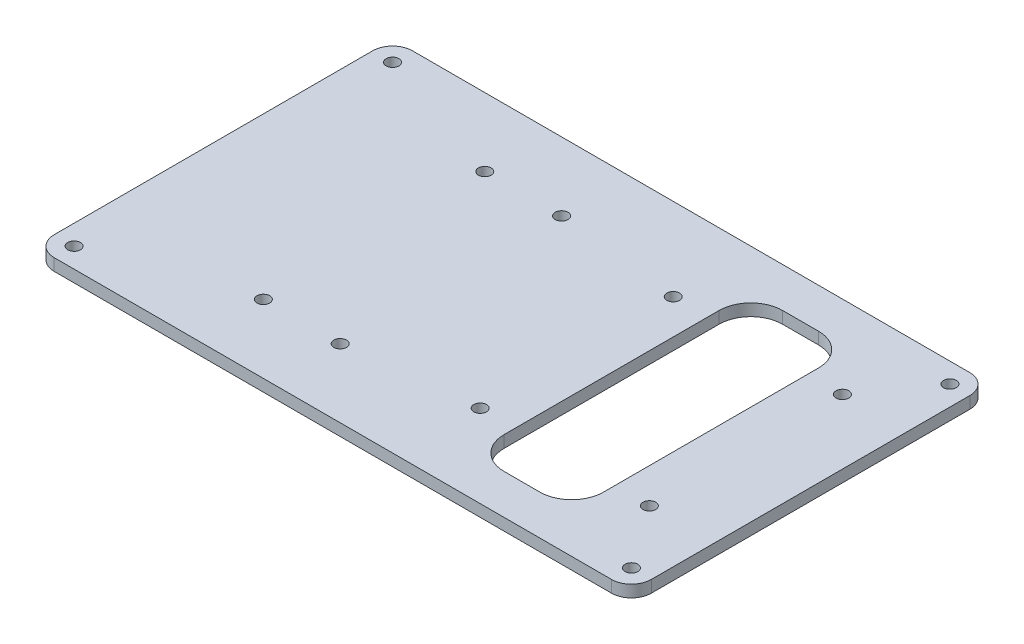
ISO-10303-21;
HEADER;
FILE_DESCRIPTION(('STEP AP214'),'2;1');
FILE_NAME('part.step','',(''),(''),'','','');
FILE_SCHEMA(('AUTOMOTIVE_DESIGN { 1 0 10303 214 1 1 1 1 }'));
ENDSEC;
DATA;
#1=APPLICATION_CONTEXT('core data for automotive mechanical design processes');
#2=APPLICATION_PROTOCOL_DEFINITION('international standard','automotive_design',2000,#1);
#3=PRODUCT_CONTEXT('',#1,'mechanical');
#4=PRODUCT('Part','Part','',(#3));
#5=PRODUCT_RELATED_PRODUCT_CATEGORY('part','',(#4));
#6=PRODUCT_DEFINITION_FORMATION('','',#4);
#7=PRODUCT_DEFINITION_CONTEXT('part definition',#1,'design');
#8=PRODUCT_DEFINITION('design','',#6,#7);
#9=PRODUCT_DEFINITION_SHAPE('','',#8);
#10=(LENGTH_UNIT() NAMED_UNIT(*) SI_UNIT(.MILLI.,.METRE.));
#11=(NAMED_UNIT(*) PLANE_ANGLE_UNIT() SI_UNIT($,.RADIAN.));
#12=(NAMED_UNIT(*) SI_UNIT($,.STERADIAN.) SOLID_ANGLE_UNIT());
#13=UNCERTAINTY_MEASURE_WITH_UNIT(LENGTH_MEASURE(1.E-05),#10,'distance_accuracy_value','');
#14=(GEOMETRIC_REPRESENTATION_CONTEXT(3) GLOBAL_UNCERTAINTY_ASSIGNED_CONTEXT((#13)) GLOBAL_UNIT_ASSIGNED_CONTEXT((#10,
#11,#12)) REPRESENTATION_CONTEXT('',''));
#15=CARTESIAN_POINT('',(0.,0.,0.));
#16=DIRECTION('',(0.,0.,1.));
#17=DIRECTION('',(1.,0.,0.));
#18=AXIS2_PLACEMENT_3D('',#15,#16,#17);
#19=CARTESIAN_POINT('',(-70.,3.,-40.));
#20=DIRECTION('',(0.,1.,0.));
#21=DIRECTION('',(0.,0.,1.));
#22=AXIS2_PLACEMENT_3D('',#19,#20,#21);
#23=PLANE('',#22);
#24=CARTESIAN_POINT('',(70.,3.,-40.));
#25=DIRECTION('',(0.,1.,0.));
#26=DIRECTION('',(0.,0.,-1.));
#27=AXIS2_PLACEMENT_3D('',#24,#25,#26);
#28=CIRCLE('',#27,1.60000000000001);
#29=CARTESIAN_POINT('',(70.,3.,-41.6));
#30=VERTEX_POINT('',#29);
#31=EDGE_CURVE('E456',#30,#30,#28,.T.);
#32=ORIENTED_EDGE('',*,*,#31,.F.);
#33=EDGE_LOOP('',(#32));
#34=FACE_BOUND('',#33,.T.);
#35=CARTESIAN_POINT('',(-34.65,3.,27.81));
#36=DIRECTION('',(0.,1.,0.));
#37=DIRECTION('',(0.,0.,-1.));
#38=AXIS2_PLACEMENT_3D('',#35,#36,#37);
#39=CIRCLE('',#38,1.6);
#40=CARTESIAN_POINT('',(-34.65,3.,26.21));
#41=VERTEX_POINT('',#40);
#42=EDGE_CURVE('E468',#41,#41,#39,.T.);
#43=ORIENTED_EDGE('',*,*,#42,.F.);
#44=EDGE_LOOP('',(#43));
#45=FACE_BOUND('',#44,.T.);
#46=CARTESIAN_POINT('',(-15.35,3.,-27.81));
#47=DIRECTION('',(0.,1.,0.));
#48=DIRECTION('',(0.,0.,-1.));
#49=AXIS2_PLACEMENT_3D('',#46,#47,#48);
#50=CIRCLE('',#49,1.6);
#51=CARTESIAN_POINT('',(-15.35,3.,-29.41));
#52=VERTEX_POINT('',#51);
#53=EDGE_CURVE('E480',#52,#52,#50,.T.);
#54=ORIENTED_EDGE('',*,*,#53,.F.);
#55=EDGE_LOOP('',(#54));
#56=FACE_BOUND('',#55,.T.);
#57=CARTESIAN_POINT('',(-34.65,3.,-27.81));
#58=DIRECTION('',(0.,1.,0.));
#59=DIRECTION('',(0.,0.,1.));
#60=AXIS2_PLACEMENT_3D('',#57,#58,#59);
#61=CIRCLE('',#60,1.6);
#62=CARTESIAN_POINT('',(-34.65,3.,-26.21));
#63=VERTEX_POINT('',#62);
#64=EDGE_CURVE('E188',#63,#63,#61,.T.);
#65=ORIENTED_EDGE('',*,*,#64,.F.);
#66=EDGE_LOOP('',(#65));
#67=FACE_BOUND('',#66,.T.);
#68=CARTESIAN_POINT('',(58.75,3.,24.25));
#69=DIRECTION('',(0.,1.,0.));
#70=DIRECTION('',(0.,0.,1.));
#71=AXIS2_PLACEMENT_3D('',#68,#69,#70);
#72=CIRCLE('',#71,1.6);
#73=CARTESIAN_POINT('',(58.75,3.,25.85));
#74=VERTEX_POINT('',#73);
#75=EDGE_CURVE('E224',#74,#74,#72,.T.);
#76=ORIENTED_EDGE('',*,*,#75,.F.);
#77=EDGE_LOOP('',(#76));
#78=FACE_BOUND('',#77,.T.);
#79=CARTESIAN_POINT('',(16.25,3.,-24.25));
#80=DIRECTION('',(0.,1.,0.));
#81=DIRECTION('',(0.,0.,1.));
#82=AXIS2_PLACEMENT_3D('',#79,#80,#81);
#83=CIRCLE('',#82,1.6);
#84=CARTESIAN_POINT('',(16.25,3.,-22.65));
#85=VERTEX_POINT('',#84);
#86=EDGE_CURVE('E236',#85,#85,#83,.T.);
#87=ORIENTED_EDGE('',*,*,#86,.F.);
#88=EDGE_LOOP('',(#87));
#89=FACE_BOUND('',#88,.T.);
#90=CARTESIAN_POINT('',(-70.,3.,-40.));
#91=DIRECTION('',(0.,1.,0.));
#92=DIRECTION('',(0.,0.,1.));
#93=AXIS2_PLACEMENT_3D('',#90,#91,#92);
#94=CIRCLE('',#93,5.);
#95=CARTESIAN_POINT('',(-70.,3.,-45.));
#96=VERTEX_POINT('',#95);
#97=CARTESIAN_POINT('',(-75.,3.,-40.));
#98=VERTEX_POINT('',#97);
#99=EDGE_CURVE('E242',#96,#98,#94,.T.);
#100=ORIENTED_EDGE('',*,*,#99,.T.);
#101=DIRECTION('',(0.,0.,1.));
#102=VECTOR('',#101,1.);
#103=CARTESIAN_POINT('',(-75.,3.,-40.));
#104=LINE('',#103,#102);
#105=CARTESIAN_POINT('',(-75.,3.,39.9999999999999));
#106=VERTEX_POINT('',#105);
#107=EDGE_CURVE('E245',#98,#106,#104,.T.);
#108=ORIENTED_EDGE('',*,*,#107,.T.);
#109=CARTESIAN_POINT('',(-70.,3.,40.));
#110=DIRECTION('',(0.,1.,0.));
#111=DIRECTION('',(0.,0.,1.));
#112=AXIS2_PLACEMENT_3D('',#109,#110,#111);
#113=CIRCLE('',#112,5.);
#114=CARTESIAN_POINT('',(-70.,3.,45.));
#115=VERTEX_POINT('',#114);
#116=EDGE_CURVE('E248',#106,#115,#113,.T.);
#117=ORIENTED_EDGE('',*,*,#116,.T.);
#118=DIRECTION('',(1.,0.,0.));
#119=VECTOR('',#118,1.);
#120=CARTESIAN_POINT('',(-70.,3.,45.));
#121=LINE('',#120,#119);
#122=CARTESIAN_POINT('',(69.9999999999999,3.,45.));
#123=VERTEX_POINT('',#122);
#124=EDGE_CURVE('E250',#115,#123,#121,.T.);
#125=ORIENTED_EDGE('',*,*,#124,.T.);
#126=CARTESIAN_POINT('',(70.,3.,40.));
#127=DIRECTION('',(0.,1.,0.));
#128=DIRECTION('',(0.,0.,1.));
#129=AXIS2_PLACEMENT_3D('',#126,#127,#128);
#130=CIRCLE('',#129,5.);
#131=CARTESIAN_POINT('',(75.,3.,40.));
#132=VERTEX_POINT('',#131);
#133=EDGE_CURVE('E252',#123,#132,#130,.T.);
#134=ORIENTED_EDGE('',*,*,#133,.T.);
#135=DIRECTION('',(0.,0.,-1.));
#136=VECTOR('',#135,1.);
#137=CARTESIAN_POINT('',(75.,3.,-40.));
#138=LINE('',#137,#136);
#139=CARTESIAN_POINT('',(75.,3.,-40.));
#140=VERTEX_POINT('',#139);
#141=EDGE_CURVE('E254',#132,#140,#138,.T.);
#142=ORIENTED_EDGE('',*,*,#141,.T.);
#143=CARTESIAN_POINT('',(70.,3.,-40.));
#144=DIRECTION('',(0.,1.,0.));
#145=DIRECTION('',(0.,0.,1.));
#146=AXIS2_PLACEMENT_3D('',#143,#144,#145);
#147=CIRCLE('',#146,5.);
#148=CARTESIAN_POINT('',(69.9999999999999,3.,-45.));
#149=VERTEX_POINT('',#148);
#150=EDGE_CURVE('E256',#140,#149,#147,.T.);
#151=ORIENTED_EDGE('',*,*,#150,.T.);
#152=DIRECTION('',(-1.,0.,0.));
#153=VECTOR('',#152,1.);
#154=CARTESIAN_POINT('',(-70.,3.,-45.));
#155=LINE('',#154,#153);
#156=EDGE_CURVE('E258',#149,#96,#155,.T.);
#157=ORIENTED_EDGE('',*,*,#156,.T.);
#158=EDGE_LOOP('',(#100,#108,#117,#125,#134,#142,#151,#157));
#159=FACE_BOUND('',#158,.T.);
#160=CARTESIAN_POINT('',(58.75,3.,-24.25));
#161=DIRECTION('',(0.,1.,0.));
#162=DIRECTION('',(0.,0.,-1.));
#163=AXIS2_PLACEMENT_3D('',#160,#161,#162);
#164=CIRCLE('',#163,1.6);
#165=CARTESIAN_POINT('',(58.75,3.,-25.85));
#166=VERTEX_POINT('',#165);
#167=EDGE_CURVE('E230',#166,#166,#164,.T.);
#168=ORIENTED_EDGE('',*,*,#167,.F.);
#169=EDGE_LOOP('',(#168));
#170=FACE_BOUND('',#169,.T.);
#171=CARTESIAN_POINT('',(16.25,3.,24.25));
#172=DIRECTION('',(0.,1.,0.));
#173=DIRECTION('',(0.,0.,-1.));
#174=AXIS2_PLACEMENT_3D('',#171,#172,#173);
#175=CIRCLE('',#174,1.6);
#176=CARTESIAN_POINT('',(16.25,3.,22.65));
#177=VERTEX_POINT('',#176);
#178=EDGE_CURVE('E218',#177,#177,#175,.T.);
#179=ORIENTED_EDGE('',*,*,#178,.F.);
#180=EDGE_LOOP('',(#179));
#181=FACE_BOUND('',#180,.T.);
#182=DIRECTION('',(-1.,0.,0.));
#183=VECTOR('',#182,1.);
#184=CARTESIAN_POINT('',(33.0000000000001,3.,-35.));
#185=LINE('',#184,#183);
#186=CARTESIAN_POINT('',(42.,3.,-35.));
#187=VERTEX_POINT('',#186);
#188=CARTESIAN_POINT('',(33.0000000000001,3.,-35.));
#189=VERTEX_POINT('',#188);
#190=EDGE_CURVE('E158',#187,#189,#185,.T.);
#191=ORIENTED_EDGE('',*,*,#190,.F.);
#192=CARTESIAN_POINT('',(42.,3.,-27.));
#193=DIRECTION('',(0.,1.,0.));
#194=DIRECTION('',(0.,0.,-1.));
#195=AXIS2_PLACEMENT_3D('',#192,#193,#194);
#196=CIRCLE('',#195,8.);
#197=CARTESIAN_POINT('',(50.,3.,-26.9999999999999));
#198=VERTEX_POINT('',#197);
#199=EDGE_CURVE('E150',#198,#187,#196,.T.);
#200=ORIENTED_EDGE('',*,*,#199,.F.);
#201=DIRECTION('',(0.,0.,-1.));
#202=VECTOR('',#201,1.);
#203=CARTESIAN_POINT('',(50.,3.,-26.9999999999999));
#204=LINE('',#203,#202);
#205=CARTESIAN_POINT('',(50.,3.,26.9999999999999));
#206=VERTEX_POINT('',#205);
#207=EDGE_CURVE('E185',#206,#198,#204,.T.);
#208=ORIENTED_EDGE('',*,*,#207,.F.);
#209=CARTESIAN_POINT('',(42.,3.,27.));
#210=DIRECTION('',(0.,1.,0.));
#211=DIRECTION('',(0.,0.,-1.));
#212=AXIS2_PLACEMENT_3D('',#209,#210,#211);
#213=CIRCLE('',#212,8.);
#214=CARTESIAN_POINT('',(42.,3.,35.));
#215=VERTEX_POINT('',#214);
#216=EDGE_CURVE('E183',#215,#206,#213,.T.);
#217=ORIENTED_EDGE('',*,*,#216,.F.);
#218=DIRECTION('',(1.,0.,0.));
#219=VECTOR('',#218,1.);
#220=CARTESIAN_POINT('',(33.0000000000001,3.,35.));
#221=LINE('',#220,#219);
#222=CARTESIAN_POINT('',(33.0000000000001,3.,35.));
#223=VERTEX_POINT('',#222);
#224=EDGE_CURVE('E181',#223,#215,#221,.T.);
#225=ORIENTED_EDGE('',*,*,#224,.F.);
#226=CARTESIAN_POINT('',(33.,3.,27.));
#227=DIRECTION('',(0.,1.,0.));
#228=DIRECTION('',(0.,0.,-1.));
#229=AXIS2_PLACEMENT_3D('',#226,#227,#228);
#230=CIRCLE('',#229,8.);
#231=CARTESIAN_POINT('',(25.,3.,26.9999999999999));
#232=VERTEX_POINT('',#231);
#233=EDGE_CURVE('E179',#232,#223,#230,.T.);
#234=ORIENTED_EDGE('',*,*,#233,.F.);
#235=DIRECTION('',(0.,0.,1.));
#236=VECTOR('',#235,1.);
#237=CARTESIAN_POINT('',(25.,3.,-26.9999999999999));
#238=LINE('',#237,#236);
#239=CARTESIAN_POINT('',(25.,3.,-26.9999999999999));
#240=VERTEX_POINT('',#239);
#241=EDGE_CURVE('E174',#240,#232,#238,.T.);
#242=ORIENTED_EDGE('',*,*,#241,.F.);
#243=CARTESIAN_POINT('',(33.,3.,-27.));
#244=DIRECTION('',(0.,1.,0.));
#245=DIRECTION('',(0.,0.,-1.));
#246=AXIS2_PLACEMENT_3D('',#243,#244,#245);
#247=CIRCLE('',#246,8.);
#248=EDGE_CURVE('E172',#189,#240,#247,.T.);
#249=ORIENTED_EDGE('',*,*,#248,.F.);
#250=EDGE_LOOP('',(#191,#200,#208,#217,#225,#234,#242,#249));
#251=FACE_BOUND('',#250,.T.);
#252=CARTESIAN_POINT('',(-70.,3.,40.));
#253=DIRECTION('',(0.,1.,0.));
#254=DIRECTION('',(0.,0.,-1.));
#255=AXIS2_PLACEMENT_3D('',#252,#253,#254);
#256=CIRCLE('',#255,1.59999999999998);
#257=CARTESIAN_POINT('',(-70.,3.,38.4));
#258=VERTEX_POINT('',#257);
#259=EDGE_CURVE('E486',#258,#258,#256,.T.);
#260=ORIENTED_EDGE('',*,*,#259,.F.);
#261=EDGE_LOOP('',(#260));
#262=FACE_BOUND('',#261,.T.);
#263=CARTESIAN_POINT('',(-15.35,3.,27.81));
#264=DIRECTION('',(0.,1.,0.));
#265=DIRECTION('',(0.,0.,1.));
#266=AXIS2_PLACEMENT_3D('',#263,#264,#265);
#267=CIRCLE('',#266,1.6);
#268=CARTESIAN_POINT('',(-15.35,3.,29.41));
#269=VERTEX_POINT('',#268);
#270=EDGE_CURVE('E474',#269,#269,#267,.T.);
#271=ORIENTED_EDGE('',*,*,#270,.F.);
#272=EDGE_LOOP('',(#271));
#273=FACE_BOUND('',#272,.T.);
#274=CARTESIAN_POINT('',(-70.,3.,-40.));
#275=DIRECTION('',(0.,1.,0.));
#276=DIRECTION('',(0.,0.,1.));
#277=AXIS2_PLACEMENT_3D('',#274,#275,#276);
#278=CIRCLE('',#277,1.60000000000001);
#279=CARTESIAN_POINT('',(-70.,3.,-38.4));
#280=VERTEX_POINT('',#279);
#281=EDGE_CURVE('E462',#280,#280,#278,.T.);
#282=ORIENTED_EDGE('',*,*,#281,.F.);
#283=EDGE_LOOP('',(#282));
#284=FACE_BOUND('',#283,.T.);
#285=CARTESIAN_POINT('',(70.,3.,40.));
#286=DIRECTION('',(0.,1.,0.));
#287=DIRECTION('',(0.,0.,1.));
#288=AXIS2_PLACEMENT_3D('',#285,#286,#287);
#289=CIRCLE('',#288,1.59999999999996);
#290=CARTESIAN_POINT('',(70.,3.,41.6));
#291=VERTEX_POINT('',#290);
#292=EDGE_CURVE('E447',#291,#291,#289,.T.);
#293=ORIENTED_EDGE('',*,*,#292,.F.);
#294=EDGE_LOOP('',(#293));
#295=FACE_BOUND('',#294,.T.);
#296=ADVANCED_FACE('F37',(#34,#45,#56,#67,#78,#89,#159,#170,#181,#251,#262,#273,#284,#295),#23,.T.);
#297=CARTESIAN_POINT('',(-70.,0.,-40.));
#298=DIRECTION('',(0.,1.,0.));
#299=DIRECTION('',(0.,0.,1.));
#300=AXIS2_PLACEMENT_3D('',#297,#298,#299);
#301=PLANE('',#300);
#302=CARTESIAN_POINT('',(16.25,0.,24.25));
#303=DIRECTION('',(0.,1.,0.));
#304=DIRECTION('',(0.,0.,-1.));
#305=AXIS2_PLACEMENT_3D('',#302,#303,#304);
#306=CIRCLE('',#305,1.6);
#307=CARTESIAN_POINT('',(16.25,0.,22.65));
#308=VERTEX_POINT('',#307);
#309=EDGE_CURVE('E166',#308,#308,#306,.T.);
#310=ORIENTED_EDGE('',*,*,#309,.T.);
#311=EDGE_LOOP('',(#310));
#312=FACE_BOUND('',#311,.T.);
#313=CARTESIAN_POINT('',(58.75,0.,24.25));
#314=DIRECTION('',(0.,1.,0.));
#315=DIRECTION('',(0.,0.,1.));
#316=AXIS2_PLACEMENT_3D('',#313,#314,#315);
#317=CIRCLE('',#316,1.6);
#318=CARTESIAN_POINT('',(58.75,0.,25.85));
#319=VERTEX_POINT('',#318);
#320=EDGE_CURVE('E221',#319,#319,#317,.T.);
#321=ORIENTED_EDGE('',*,*,#320,.T.);
#322=EDGE_LOOP('',(#321));
#323=FACE_BOUND('',#322,.T.);
#324=CARTESIAN_POINT('',(58.75,0.,-24.25));
#325=DIRECTION('',(0.,1.,0.));
#326=DIRECTION('',(0.,0.,-1.));
#327=AXIS2_PLACEMENT_3D('',#324,#325,#326);
#328=CIRCLE('',#327,1.6);
#329=CARTESIAN_POINT('',(58.75,0.,-25.85));
#330=VERTEX_POINT('',#329);
#331=EDGE_CURVE('E227',#330,#330,#328,.T.);
#332=ORIENTED_EDGE('',*,*,#331,.T.);
#333=EDGE_LOOP('',(#332));
#334=FACE_BOUND('',#333,.T.);
#335=CARTESIAN_POINT('',(16.25,0.,-24.25));
#336=DIRECTION('',(0.,1.,0.));
#337=DIRECTION('',(0.,0.,1.));
#338=AXIS2_PLACEMENT_3D('',#335,#336,#337);
#339=CIRCLE('',#338,1.6);
#340=CARTESIAN_POINT('',(16.25,0.,-22.65));
#341=VERTEX_POINT('',#340);
#342=EDGE_CURVE('E233',#341,#341,#339,.T.);
#343=ORIENTED_EDGE('',*,*,#342,.T.);
#344=EDGE_LOOP('',(#343));
#345=FACE_BOUND('',#344,.T.);
#346=CARTESIAN_POINT('',(-70.,0.,-40.));
#347=DIRECTION('',(0.,1.,0.));
#348=DIRECTION('',(0.,0.,1.));
#349=AXIS2_PLACEMENT_3D('',#346,#347,#348);
#350=CIRCLE('',#349,5.);
#351=CARTESIAN_POINT('',(-70.,0.,-45.));
#352=VERTEX_POINT('',#351);
#353=CARTESIAN_POINT('',(-75.,0.,-40.));
#354=VERTEX_POINT('',#353);
#355=EDGE_CURVE('E239',#352,#354,#350,.T.);
#356=ORIENTED_EDGE('',*,*,#355,.F.);
#357=DIRECTION('',(-1.,0.,0.));
#358=VECTOR('',#357,1.);
#359=CARTESIAN_POINT('',(-70.,0.,-45.));
#360=LINE('',#359,#358);
#361=CARTESIAN_POINT('',(69.9999999999999,0.,-45.));
#362=VERTEX_POINT('',#361);
#363=EDGE_CURVE('E246',#362,#352,#360,.T.);
#364=ORIENTED_EDGE('',*,*,#363,.F.);
#365=CARTESIAN_POINT('',(70.,0.,-40.));
#366=DIRECTION('',(0.,1.,0.));
#367=DIRECTION('',(0.,0.,1.));
#368=AXIS2_PLACEMENT_3D('',#365,#366,#367);
#369=CIRCLE('',#368,5.);
#370=CARTESIAN_POINT('',(75.,0.,-40.));
#371=VERTEX_POINT('',#370);
#372=EDGE_CURVE('E273',#371,#362,#369,.T.);
#373=ORIENTED_EDGE('',*,*,#372,.F.);
#374=DIRECTION('',(0.,0.,-1.));
#375=VECTOR('',#374,1.);
#376=CARTESIAN_POINT('',(75.,0.,-40.));
#377=LINE('',#376,#375);
#378=CARTESIAN_POINT('',(75.,0.,40.));
#379=VERTEX_POINT('',#378);
#380=EDGE_CURVE('E271',#379,#371,#377,.T.);
#381=ORIENTED_EDGE('',*,*,#380,.F.);
#382=CARTESIAN_POINT('',(70.,0.,40.));
#383=DIRECTION('',(0.,1.,0.));
#384=DIRECTION('',(0.,0.,1.));
#385=AXIS2_PLACEMENT_3D('',#382,#383,#384);
#386=CIRCLE('',#385,5.);
#387=CARTESIAN_POINT('',(69.9999999999999,0.,45.));
#388=VERTEX_POINT('',#387);
#389=EDGE_CURVE('E269',#388,#379,#386,.T.);
#390=ORIENTED_EDGE('',*,*,#389,.F.);
#391=DIRECTION('',(1.,0.,0.));
#392=VECTOR('',#391,1.);
#393=CARTESIAN_POINT('',(-70.,0.,45.));
#394=LINE('',#393,#392);
#395=CARTESIAN_POINT('',(-70.,0.,45.));
#396=VERTEX_POINT('',#395);
#397=EDGE_CURVE('E267',#396,#388,#394,.T.);
#398=ORIENTED_EDGE('',*,*,#397,.F.);
#399=CARTESIAN_POINT('',(-70.,0.,40.));
#400=DIRECTION('',(0.,1.,0.));
#401=DIRECTION('',(0.,0.,1.));
#402=AXIS2_PLACEMENT_3D('',#399,#400,#401);
#403=CIRCLE('',#402,5.);
#404=CARTESIAN_POINT('',(-75.,0.,39.9999999999999));
#405=VERTEX_POINT('',#404);
#406=EDGE_CURVE('E265',#405,#396,#403,.T.);
#407=ORIENTED_EDGE('',*,*,#406,.F.);
#408=DIRECTION('',(0.,0.,1.));
#409=VECTOR('',#408,1.);
#410=CARTESIAN_POINT('',(-75.,0.,-40.));
#411=LINE('',#410,#409);
#412=EDGE_CURVE('E263',#354,#405,#411,.T.);
#413=ORIENTED_EDGE('',*,*,#412,.F.);
#414=EDGE_LOOP('',(#356,#364,#373,#381,#390,#398,#407,#413));
#415=FACE_BOUND('',#414,.T.);
#416=CARTESIAN_POINT('',(42.,0.,-27.));
#417=DIRECTION('',(0.,1.,0.));
#418=DIRECTION('',(0.,0.,-1.));
#419=AXIS2_PLACEMENT_3D('',#416,#417,#418);
#420=CIRCLE('',#419,8.);
#421=CARTESIAN_POINT('',(50.,0.,-26.9999999999999));
#422=VERTEX_POINT('',#421);
#423=CARTESIAN_POINT('',(42.,0.,-35.));
#424=VERTEX_POINT('',#423);
#425=EDGE_CURVE('E60',#422,#424,#420,.T.);
#426=ORIENTED_EDGE('',*,*,#425,.T.);
#427=DIRECTION('',(-1.,0.,0.));
#428=VECTOR('',#427,1.);
#429=CARTESIAN_POINT('',(33.0000000000001,0.,-35.));
#430=LINE('',#429,#428);
#431=CARTESIAN_POINT('',(33.0000000000001,0.,-35.));
#432=VERTEX_POINT('',#431);
#433=EDGE_CURVE('E165',#424,#432,#430,.T.);
#434=ORIENTED_EDGE('',*,*,#433,.T.);
#435=CARTESIAN_POINT('',(33.,0.,-27.));
#436=DIRECTION('',(0.,1.,0.));
#437=DIRECTION('',(0.,0.,-1.));
#438=AXIS2_PLACEMENT_3D('',#435,#436,#437);
#439=CIRCLE('',#438,8.);
#440=CARTESIAN_POINT('',(25.,0.,-26.9999999999999));
#441=VERTEX_POINT('',#440);
#442=EDGE_CURVE('E190',#432,#441,#439,.T.);
#443=ORIENTED_EDGE('',*,*,#442,.T.);
#444=DIRECTION('',(0.,0.,1.));
#445=VECTOR('',#444,1.);
#446=CARTESIAN_POINT('',(25.,0.,-26.9999999999999));
#447=LINE('',#446,#445);
#448=CARTESIAN_POINT('',(25.,0.,26.9999999999999));
#449=VERTEX_POINT('',#448);
#450=EDGE_CURVE('E193',#441,#449,#447,.T.);
#451=ORIENTED_EDGE('',*,*,#450,.T.);
#452=CARTESIAN_POINT('',(33.,0.,27.));
#453=DIRECTION('',(0.,1.,0.));
#454=DIRECTION('',(0.,0.,-1.));
#455=AXIS2_PLACEMENT_3D('',#452,#453,#454);
#456=CIRCLE('',#455,8.);
#457=CARTESIAN_POINT('',(33.0000000000001,0.,35.));
#458=VERTEX_POINT('',#457);
#459=EDGE_CURVE('E196',#449,#458,#456,.T.);
#460=ORIENTED_EDGE('',*,*,#459,.T.);
#461=DIRECTION('',(1.,0.,0.));
#462=VECTOR('',#461,1.);
#463=CARTESIAN_POINT('',(33.0000000000001,0.,35.));
#464=LINE('',#463,#462);
#465=CARTESIAN_POINT('',(42.,0.,35.));
#466=VERTEX_POINT('',#465);
#467=EDGE_CURVE('E199',#458,#466,#464,.T.);
#468=ORIENTED_EDGE('',*,*,#467,.T.);
#469=CARTESIAN_POINT('',(42.,0.,27.));
#470=DIRECTION('',(0.,1.,0.));
#471=DIRECTION('',(0.,0.,-1.));
#472=AXIS2_PLACEMENT_3D('',#469,#470,#471);
#473=CIRCLE('',#472,8.);
#474=CARTESIAN_POINT('',(50.,0.,26.9999999999999));
#475=VERTEX_POINT('',#474);
#476=EDGE_CURVE('E202',#466,#475,#473,.T.);
#477=ORIENTED_EDGE('',*,*,#476,.T.);
#478=DIRECTION('',(0.,0.,-1.));
#479=VECTOR('',#478,1.);
#480=CARTESIAN_POINT('',(50.,0.,-26.9999999999999));
#481=LINE('',#480,#479);
#482=EDGE_CURVE('E159',#475,#422,#481,.T.);
#483=ORIENTED_EDGE('',*,*,#482,.T.);
#484=EDGE_LOOP('',(#426,#434,#443,#451,#460,#468,#477,#483));
#485=FACE_BOUND('',#484,.T.);
#486=CARTESIAN_POINT('',(-34.65,0.,-27.81));
#487=DIRECTION('',(0.,1.,0.));
#488=DIRECTION('',(0.,0.,1.));
#489=AXIS2_PLACEMENT_3D('',#486,#487,#488);
#490=CIRCLE('',#489,1.6);
#491=CARTESIAN_POINT('',(-34.65,0.,-26.21));
#492=VERTEX_POINT('',#491);
#493=EDGE_CURVE('E489',#492,#492,#490,.T.);
#494=ORIENTED_EDGE('',*,*,#493,.T.);
#495=EDGE_LOOP('',(#494));
#496=FACE_BOUND('',#495,.T.);
#497=CARTESIAN_POINT('',(-70.,0.,40.));
#498=DIRECTION('',(0.,1.,0.));
#499=DIRECTION('',(0.,0.,-1.));
#500=AXIS2_PLACEMENT_3D('',#497,#498,#499);
#501=CIRCLE('',#500,1.59999999999998);
#502=CARTESIAN_POINT('',(-70.,0.,38.4));
#503=VERTEX_POINT('',#502);
#504=EDGE_CURVE('E483',#503,#503,#501,.T.);
#505=ORIENTED_EDGE('',*,*,#504,.T.);
#506=EDGE_LOOP('',(#505));
#507=FACE_BOUND('',#506,.T.);
#508=CARTESIAN_POINT('',(-15.35,0.,-27.81));
#509=DIRECTION('',(0.,1.,0.));
#510=DIRECTION('',(0.,0.,-1.));
#511=AXIS2_PLACEMENT_3D('',#508,#509,#510);
#512=CIRCLE('',#511,1.6);
#513=CARTESIAN_POINT('',(-15.35,0.,-29.41));
#514=VERTEX_POINT('',#513);
#515=EDGE_CURVE('E477',#514,#514,#512,.T.);
#516=ORIENTED_EDGE('',*,*,#515,.T.);
#517=EDGE_LOOP('',(#516));
#518=FACE_BOUND('',#517,.T.);
#519=CARTESIAN_POINT('',(-15.35,0.,27.81));
#520=DIRECTION('',(0.,1.,0.));
#521=DIRECTION('',(0.,0.,1.));
#522=AXIS2_PLACEMENT_3D('',#519,#520,#521);
#523=CIRCLE('',#522,1.6);
#524=CARTESIAN_POINT('',(-15.35,0.,29.41));
#525=VERTEX_POINT('',#524);
#526=EDGE_CURVE('E471',#525,#525,#523,.T.);
#527=ORIENTED_EDGE('',*,*,#526,.T.);
#528=EDGE_LOOP('',(#527));
#529=FACE_BOUND('',#528,.T.);
#530=CARTESIAN_POINT('',(-34.65,0.,27.81));
#531=DIRECTION('',(0.,1.,0.));
#532=DIRECTION('',(0.,0.,-1.));
#533=AXIS2_PLACEMENT_3D('',#530,#531,#532);
#534=CIRCLE('',#533,1.6);
#535=CARTESIAN_POINT('',(-34.65,0.,26.21));
#536=VERTEX_POINT('',#535);
#537=EDGE_CURVE('E465',#536,#536,#534,.T.);
#538=ORIENTED_EDGE('',*,*,#537,.T.);
#539=EDGE_LOOP('',(#538));
#540=FACE_BOUND('',#539,.T.);
#541=CARTESIAN_POINT('',(-70.,0.,-40.));
#542=DIRECTION('',(0.,1.,0.));
#543=DIRECTION('',(0.,0.,1.));
#544=AXIS2_PLACEMENT_3D('',#541,#542,#543);
#545=CIRCLE('',#544,1.60000000000001);
#546=CARTESIAN_POINT('',(-70.,0.,-38.4));
#547=VERTEX_POINT('',#546);
#548=EDGE_CURVE('E459',#547,#547,#545,.T.);
#549=ORIENTED_EDGE('',*,*,#548,.T.);
#550=EDGE_LOOP('',(#549));
#551=FACE_BOUND('',#550,.T.);
#552=CARTESIAN_POINT('',(70.,0.,-40.));
#553=DIRECTION('',(0.,1.,0.));
#554=DIRECTION('',(0.,0.,-1.));
#555=AXIS2_PLACEMENT_3D('',#552,#553,#554);
#556=CIRCLE('',#555,1.60000000000001);
#557=CARTESIAN_POINT('',(70.,0.,-41.6));
#558=VERTEX_POINT('',#557);
#559=EDGE_CURVE('E453',#558,#558,#556,.T.);
#560=ORIENTED_EDGE('',*,*,#559,.T.);
#561=EDGE_LOOP('',(#560));
#562=FACE_BOUND('',#561,.T.);
#563=CARTESIAN_POINT('',(70.,0.,40.));
#564=DIRECTION('',(0.,1.,0.));
#565=DIRECTION('',(0.,0.,1.));
#566=AXIS2_PLACEMENT_3D('',#563,#564,#565);
#567=CIRCLE('',#566,1.59999999999996);
#568=CARTESIAN_POINT('',(70.,0.,41.6));
#569=VERTEX_POINT('',#568);
#570=EDGE_CURVE('E450',#569,#569,#567,.T.);
#571=ORIENTED_EDGE('',*,*,#570,.T.);
#572=EDGE_LOOP('',(#571));
#573=FACE_BOUND('',#572,.T.);
#574=ADVANCED_FACE('F303',(#312,#323,#334,#345,#415,#485,#496,#507,#518,#529,#540,#551,#562,
#573),#301,.F.);
#575=CARTESIAN_POINT('',(-70.,3.,-40.));
#576=DIRECTION('',(0.,-1.,0.));
#577=DIRECTION('',(0.,0.,-1.));
#578=AXIS2_PLACEMENT_3D('',#575,#576,#577);
#579=CYLINDRICAL_SURFACE('',#578,5.);
#580=ORIENTED_EDGE('',*,*,#355,.T.);
#581=DIRECTION('',(0.,-1.,0.));
#582=VECTOR('',#581,1.);
#583=CARTESIAN_POINT('',(-75.,3.,-40.));
#584=LINE('',#583,#582);
#585=EDGE_CURVE('E11',#98,#354,#584,.T.);
#586=ORIENTED_EDGE('',*,*,#585,.F.);
#587=ORIENTED_EDGE('',*,*,#99,.F.);
#588=DIRECTION('',(0.,-1.,0.));
#589=VECTOR('',#588,1.);
#590=CARTESIAN_POINT('',(-70.,3.,-45.));
#591=LINE('',#590,#589);
#592=EDGE_CURVE('E260',#96,#352,#591,.T.);
#593=ORIENTED_EDGE('',*,*,#592,.T.);
#594=EDGE_LOOP('',(#580,#586,#587,#593));
#595=FACE_BOUND('',#594,.T.);
#596=ADVANCED_FACE('F39',(#595),#579,.T.);
#597=CARTESIAN_POINT('',(-75.,3.,-40.));
#598=DIRECTION('',(1.,0.,0.));
#599=DIRECTION('',(0.,0.,-1.));
#600=AXIS2_PLACEMENT_3D('',#597,#598,#599);
#601=PLANE('',#600);
#602=ORIENTED_EDGE('',*,*,#412,.T.);
#603=DIRECTION('',(0.,-1.,0.));
#604=VECTOR('',#603,1.);
#605=CARTESIAN_POINT('',(-75.,3.,39.9999999999999));
#606=LINE('',#605,#604);
#607=EDGE_CURVE('E45',#106,#405,#606,.T.);
#608=ORIENTED_EDGE('',*,*,#607,.F.);
#609=ORIENTED_EDGE('',*,*,#107,.F.);
#610=ORIENTED_EDGE('',*,*,#585,.T.);
#611=EDGE_LOOP('',(#602,#608,#609,#610));
#612=FACE_BOUND('',#611,.T.);
#613=ADVANCED_FACE('F321',(#612),#601,.F.);
#614=CARTESIAN_POINT('',(-70.,3.,40.));
#615=DIRECTION('',(0.,-1.,0.));
#616=DIRECTION('',(0.,0.,-1.));
#617=AXIS2_PLACEMENT_3D('',#614,#615,#616);
#618=CYLINDRICAL_SURFACE('',#617,5.);
#619=ORIENTED_EDGE('',*,*,#406,.T.);
#620=DIRECTION('',(0.,-1.,0.));
#621=VECTOR('',#620,1.);
#622=CARTESIAN_POINT('',(-70.,3.,45.));
#623=LINE('',#622,#621);
#624=EDGE_CURVE('E290',#115,#396,#623,.T.);
#625=ORIENTED_EDGE('',*,*,#624,.F.);
#626=ORIENTED_EDGE('',*,*,#116,.F.);
#627=ORIENTED_EDGE('',*,*,#607,.T.);
#628=EDGE_LOOP('',(#619,#625,#626,#627));
#629=FACE_BOUND('',#628,.T.);
#630=ADVANCED_FACE('F297',(#629),#618,.T.);
#631=CARTESIAN_POINT('',(-70.,3.,45.));
#632=DIRECTION('',(0.,0.,-1.));
#633=DIRECTION('',(-1.,0.,0.));
#634=AXIS2_PLACEMENT_3D('',#631,#632,#633);
#635=PLANE('',#634);
#636=ORIENTED_EDGE('',*,*,#397,.T.);
#637=DIRECTION('',(0.,-1.,0.));
#638=VECTOR('',#637,1.);
#639=CARTESIAN_POINT('',(69.9999999999999,3.,45.));
#640=LINE('',#639,#638);
#641=EDGE_CURVE('E287',#123,#388,#640,.T.);
#642=ORIENTED_EDGE('',*,*,#641,.F.);
#643=ORIENTED_EDGE('',*,*,#124,.F.);
#644=ORIENTED_EDGE('',*,*,#624,.T.);
#645=EDGE_LOOP('',(#636,#642,#643,#644));
#646=FACE_BOUND('',#645,.T.);
#647=ADVANCED_FACE('F309',(#646),#635,.F.);
#648=CARTESIAN_POINT('',(70.,3.,40.));
#649=DIRECTION('',(0.,-1.,0.));
#650=DIRECTION('',(0.,0.,-1.));
#651=AXIS2_PLACEMENT_3D('',#648,#649,#650);
#652=CYLINDRICAL_SURFACE('',#651,5.);
#653=ORIENTED_EDGE('',*,*,#389,.T.);
#654=DIRECTION('',(0.,-1.,0.));
#655=VECTOR('',#654,1.);
#656=CARTESIAN_POINT('',(75.,3.,40.));
#657=LINE('',#656,#655);
#658=EDGE_CURVE('E284',#132,#379,#657,.T.);
#659=ORIENTED_EDGE('',*,*,#658,.F.);
#660=ORIENTED_EDGE('',*,*,#133,.F.);
#661=ORIENTED_EDGE('',*,*,#641,.T.);
#662=EDGE_LOOP('',(#653,#659,#660,#661));
#663=FACE_BOUND('',#662,.T.);
#664=ADVANCED_FACE('F313',(#663),#652,.T.);
#665=CARTESIAN_POINT('',(75.,3.,-40.));
#666=DIRECTION('',(-1.,0.,0.));
#667=DIRECTION('',(0.,0.,1.));
#668=AXIS2_PLACEMENT_3D('',#665,#666,#667);
#669=PLANE('',#668);
#670=ORIENTED_EDGE('',*,*,#380,.T.);
#671=DIRECTION('',(0.,-1.,0.));
#672=VECTOR('',#671,1.);
#673=CARTESIAN_POINT('',(75.,3.,-40.));
#674=LINE('',#673,#672);
#675=EDGE_CURVE('E281',#140,#371,#674,.T.);
#676=ORIENTED_EDGE('',*,*,#675,.F.);
#677=ORIENTED_EDGE('',*,*,#141,.F.);
#678=ORIENTED_EDGE('',*,*,#658,.T.);
#679=EDGE_LOOP('',(#670,#676,#677,#678));
#680=FACE_BOUND('',#679,.T.);
#681=ADVANCED_FACE('F334',(#680),#669,.F.);
#682=CARTESIAN_POINT('',(70.,3.,-40.));
#683=DIRECTION('',(0.,-1.,0.));
#684=DIRECTION('',(0.,0.,-1.));
#685=AXIS2_PLACEMENT_3D('',#682,#683,#684);
#686=CYLINDRICAL_SURFACE('',#685,5.);
#687=ORIENTED_EDGE('',*,*,#372,.T.);
#688=DIRECTION('',(0.,-1.,0.));
#689=VECTOR('',#688,1.);
#690=CARTESIAN_POINT('',(69.9999999999999,3.,-45.));
#691=LINE('',#690,#689);
#692=EDGE_CURVE('E278',#149,#362,#691,.T.);
#693=ORIENTED_EDGE('',*,*,#692,.F.);
#694=ORIENTED_EDGE('',*,*,#150,.F.);
#695=ORIENTED_EDGE('',*,*,#675,.T.);
#696=EDGE_LOOP('',(#687,#693,#694,#695));
#697=FACE_BOUND('',#696,.T.);
#698=ADVANCED_FACE('F332',(#697),#686,.T.);
#699=CARTESIAN_POINT('',(-70.,3.,-45.));
#700=DIRECTION('',(0.,0.,1.));
#701=DIRECTION('',(1.,0.,0.));
#702=AXIS2_PLACEMENT_3D('',#699,#700,#701);
#703=PLANE('',#702);
#704=ORIENTED_EDGE('',*,*,#363,.T.);
#705=ORIENTED_EDGE('',*,*,#592,.F.);
#706=ORIENTED_EDGE('',*,*,#156,.F.);
#707=ORIENTED_EDGE('',*,*,#692,.T.);
#708=EDGE_LOOP('',(#704,#705,#706,#707));
#709=FACE_BOUND('',#708,.T.);
#710=ADVANCED_FACE('F327',(#709),#703,.F.);
#711=CARTESIAN_POINT('',(16.25,3.,-24.25));
#712=DIRECTION('',(0.,-1.,0.));
#713=DIRECTION('',(0.,0.,-1.));
#714=AXIS2_PLACEMENT_3D('',#711,#712,#713);
#715=CYLINDRICAL_SURFACE('',#714,1.6);
#716=ORIENTED_EDGE('',*,*,#86,.T.);
#717=EDGE_LOOP('',(#716));
#718=FACE_BOUND('',#717,.T.);
#719=ORIENTED_EDGE('',*,*,#342,.F.);
#720=EDGE_LOOP('',(#719));
#721=FACE_BOUND('',#720,.T.);
#722=ADVANCED_FACE('F354',(#718,#721),#715,.F.);
#723=CARTESIAN_POINT('',(58.75,3.,-24.25));
#724=DIRECTION('',(0.,-1.,0.));
#725=DIRECTION('',(0.,0.,-1.));
#726=AXIS2_PLACEMENT_3D('',#723,#724,#725);
#727=CYLINDRICAL_SURFACE('',#726,1.6);
#728=ORIENTED_EDGE('',*,*,#167,.T.);
#729=EDGE_LOOP('',(#728));
#730=FACE_BOUND('',#729,.T.);
#731=ORIENTED_EDGE('',*,*,#331,.F.);
#732=EDGE_LOOP('',(#731));
#733=FACE_BOUND('',#732,.T.);
#734=ADVANCED_FACE('F361',(#730,#733),#727,.F.);
#735=CARTESIAN_POINT('',(58.75,3.,24.25));
#736=DIRECTION('',(0.,-1.,0.));
#737=DIRECTION('',(0.,0.,-1.));
#738=AXIS2_PLACEMENT_3D('',#735,#736,#737);
#739=CYLINDRICAL_SURFACE('',#738,1.6);
#740=ORIENTED_EDGE('',*,*,#75,.T.);
#741=EDGE_LOOP('',(#740));
#742=FACE_BOUND('',#741,.T.);
#743=ORIENTED_EDGE('',*,*,#320,.F.);
#744=EDGE_LOOP('',(#743));
#745=FACE_BOUND('',#744,.T.);
#746=ADVANCED_FACE('F366',(#742,#745),#739,.F.);
#747=CARTESIAN_POINT('',(16.25,3.,24.25));
#748=DIRECTION('',(0.,-1.,0.));
#749=DIRECTION('',(0.,0.,-1.));
#750=AXIS2_PLACEMENT_3D('',#747,#748,#749);
#751=CYLINDRICAL_SURFACE('',#750,1.6);
#752=ORIENTED_EDGE('',*,*,#178,.T.);
#753=EDGE_LOOP('',(#752));
#754=FACE_BOUND('',#753,.T.);
#755=ORIENTED_EDGE('',*,*,#309,.F.);
#756=EDGE_LOOP('',(#755));
#757=FACE_BOUND('',#756,.T.);
#758=ADVANCED_FACE('F376',(#754,#757),#751,.F.);
#759=CARTESIAN_POINT('',(42.,3.,-27.));
#760=DIRECTION('',(0.,-1.,0.));
#761=DIRECTION('',(0.,0.,-1.));
#762=AXIS2_PLACEMENT_3D('',#759,#760,#761);
#763=CYLINDRICAL_SURFACE('',#762,8.);
#764=ORIENTED_EDGE('',*,*,#425,.F.);
#765=DIRECTION('',(0.,-1.,0.));
#766=VECTOR('',#765,1.);
#767=CARTESIAN_POINT('',(50.,3.,-26.9999999999999));
#768=LINE('',#767,#766);
#769=EDGE_CURVE('E154',#198,#422,#768,.T.);
#770=ORIENTED_EDGE('',*,*,#769,.F.);
#771=ORIENTED_EDGE('',*,*,#199,.T.);
#772=DIRECTION('',(0.,-1.,0.));
#773=VECTOR('',#772,1.);
#774=CARTESIAN_POINT('',(42.,3.,-35.));
#775=LINE('',#774,#773);
#776=EDGE_CURVE('E153',#187,#424,#775,.T.);
#777=ORIENTED_EDGE('',*,*,#776,.T.);
#778=EDGE_LOOP('',(#764,#770,#771,#777));
#779=FACE_BOUND('',#778,.T.);
#780=ADVANCED_FACE('F152',(#779),#763,.F.);
#781=CARTESIAN_POINT('',(33.0000000000001,3.,-35.));
#782=DIRECTION('',(0.,0.,1.));
#783=DIRECTION('',(1.,0.,0.));
#784=AXIS2_PLACEMENT_3D('',#781,#782,#783);
#785=PLANE('',#784);
#786=ORIENTED_EDGE('',*,*,#433,.F.);
#787=ORIENTED_EDGE('',*,*,#776,.F.);
#788=ORIENTED_EDGE('',*,*,#190,.T.);
#789=DIRECTION('',(0.,-1.,0.));
#790=VECTOR('',#789,1.);
#791=CARTESIAN_POINT('',(33.0000000000001,3.,-35.));
#792=LINE('',#791,#790);
#793=EDGE_CURVE('E167',#189,#432,#792,.T.);
#794=ORIENTED_EDGE('',*,*,#793,.T.);
#795=EDGE_LOOP('',(#786,#787,#788,#794));
#796=FACE_BOUND('',#795,.T.);
#797=ADVANCED_FACE('F162',(#796),#785,.T.);
#798=CARTESIAN_POINT('',(33.,3.,-27.));
#799=DIRECTION('',(0.,-1.,0.));
#800=DIRECTION('',(0.,0.,-1.));
#801=AXIS2_PLACEMENT_3D('',#798,#799,#800);
#802=CYLINDRICAL_SURFACE('',#801,8.);
#803=ORIENTED_EDGE('',*,*,#442,.F.);
#804=ORIENTED_EDGE('',*,*,#793,.F.);
#805=ORIENTED_EDGE('',*,*,#248,.T.);
#806=DIRECTION('',(0.,-1.,0.));
#807=VECTOR('',#806,1.);
#808=CARTESIAN_POINT('',(25.,3.,-26.9999999999999));
#809=LINE('',#808,#807);
#810=EDGE_CURVE('E215',#240,#441,#809,.T.);
#811=ORIENTED_EDGE('',*,*,#810,.T.);
#812=EDGE_LOOP('',(#803,#804,#805,#811));
#813=FACE_BOUND('',#812,.T.);
#814=ADVANCED_FACE('F388',(#813),#802,.F.);
#815=CARTESIAN_POINT('',(25.,3.,-26.9999999999999));
#816=DIRECTION('',(1.,0.,0.));
#817=DIRECTION('',(0.,0.,-1.));
#818=AXIS2_PLACEMENT_3D('',#815,#816,#817);
#819=PLANE('',#818);
#820=ORIENTED_EDGE('',*,*,#450,.F.);
#821=ORIENTED_EDGE('',*,*,#810,.F.);
#822=ORIENTED_EDGE('',*,*,#241,.T.);
#823=DIRECTION('',(0.,-1.,0.));
#824=VECTOR('',#823,1.);
#825=CARTESIAN_POINT('',(25.,3.,26.9999999999999));
#826=LINE('',#825,#824);
#827=EDGE_CURVE('E213',#232,#449,#826,.T.);
#828=ORIENTED_EDGE('',*,*,#827,.T.);
#829=EDGE_LOOP('',(#820,#821,#822,#828));
#830=FACE_BOUND('',#829,.T.);
#831=ADVANCED_FACE('F391',(#830),#819,.T.);
#832=CARTESIAN_POINT('',(33.,3.,27.));
#833=DIRECTION('',(0.,-1.,0.));
#834=DIRECTION('',(0.,0.,-1.));
#835=AXIS2_PLACEMENT_3D('',#832,#833,#834);
#836=CYLINDRICAL_SURFACE('',#835,8.);
#837=ORIENTED_EDGE('',*,*,#459,.F.);
#838=ORIENTED_EDGE('',*,*,#827,.F.);
#839=ORIENTED_EDGE('',*,*,#233,.T.);
#840=DIRECTION('',(0.,-1.,0.));
#841=VECTOR('',#840,1.);
#842=CARTESIAN_POINT('',(33.0000000000001,3.,35.));
#843=LINE('',#842,#841);
#844=EDGE_CURVE('E211',#223,#458,#843,.T.);
#845=ORIENTED_EDGE('',*,*,#844,.T.);
#846=EDGE_LOOP('',(#837,#838,#839,#845));
#847=FACE_BOUND('',#846,.T.);
#848=ADVANCED_FACE('F395',(#847),#836,.F.);
#849=CARTESIAN_POINT('',(33.0000000000001,3.,35.));
#850=DIRECTION('',(0.,0.,-1.));
#851=DIRECTION('',(-1.,0.,0.));
#852=AXIS2_PLACEMENT_3D('',#849,#850,#851);
#853=PLANE('',#852);
#854=ORIENTED_EDGE('',*,*,#467,.F.);
#855=ORIENTED_EDGE('',*,*,#844,.F.);
#856=ORIENTED_EDGE('',*,*,#224,.T.);
#857=DIRECTION('',(0.,-1.,0.));
#858=VECTOR('',#857,1.);
#859=CARTESIAN_POINT('',(42.,3.,35.));
#860=LINE('',#859,#858);
#861=EDGE_CURVE('E209',#215,#466,#860,.T.);
#862=ORIENTED_EDGE('',*,*,#861,.T.);
#863=EDGE_LOOP('',(#854,#855,#856,#862));
#864=FACE_BOUND('',#863,.T.);
#865=ADVANCED_FACE('F399',(#864),#853,.T.);
#866=CARTESIAN_POINT('',(42.,3.,27.));
#867=DIRECTION('',(0.,-1.,0.));
#868=DIRECTION('',(0.,0.,-1.));
#869=AXIS2_PLACEMENT_3D('',#866,#867,#868);
#870=CYLINDRICAL_SURFACE('',#869,8.);
#871=ORIENTED_EDGE('',*,*,#476,.F.);
#872=ORIENTED_EDGE('',*,*,#861,.F.);
#873=ORIENTED_EDGE('',*,*,#216,.T.);
#874=DIRECTION('',(0.,-1.,0.));
#875=VECTOR('',#874,1.);
#876=CARTESIAN_POINT('',(50.,3.,26.9999999999999));
#877=LINE('',#876,#875);
#878=EDGE_CURVE('E52',#206,#475,#877,.T.);
#879=ORIENTED_EDGE('',*,*,#878,.T.);
#880=EDGE_LOOP('',(#871,#872,#873,#879));
#881=FACE_BOUND('',#880,.T.);
#882=ADVANCED_FACE('F403',(#881),#870,.F.);
#883=CARTESIAN_POINT('',(50.,3.,-26.9999999999999));
#884=DIRECTION('',(-1.,0.,0.));
#885=DIRECTION('',(0.,0.,1.));
#886=AXIS2_PLACEMENT_3D('',#883,#884,#885);
#887=PLANE('',#886);
#888=ORIENTED_EDGE('',*,*,#482,.F.);
#889=ORIENTED_EDGE('',*,*,#878,.F.);
#890=ORIENTED_EDGE('',*,*,#207,.T.);
#891=ORIENTED_EDGE('',*,*,#769,.T.);
#892=EDGE_LOOP('',(#888,#889,#890,#891));
#893=FACE_BOUND('',#892,.T.);
#894=ADVANCED_FACE('F407',(#893),#887,.T.);
#895=CARTESIAN_POINT('',(-34.65,3.,-27.81));
#896=DIRECTION('',(0.,-1.,0.));
#897=DIRECTION('',(0.,0.,-1.));
#898=AXIS2_PLACEMENT_3D('',#895,#896,#897);
#899=CYLINDRICAL_SURFACE('',#898,1.6);
#900=ORIENTED_EDGE('',*,*,#64,.T.);
#901=EDGE_LOOP('',(#900));
#902=FACE_BOUND('',#901,.T.);
#903=ORIENTED_EDGE('',*,*,#493,.F.);
#904=EDGE_LOOP('',(#903));
#905=FACE_BOUND('',#904,.T.);
#906=ADVANCED_FACE('F411',(#902,#905),#899,.F.);
#907=CARTESIAN_POINT('',(-70.,3.,40.));
#908=DIRECTION('',(0.,-1.,0.));
#909=DIRECTION('',(0.,0.,-1.));
#910=AXIS2_PLACEMENT_3D('',#907,#908,#909);
#911=CYLINDRICAL_SURFACE('',#910,1.59999999999998);
#912=ORIENTED_EDGE('',*,*,#259,.T.);
#913=EDGE_LOOP('',(#912));
#914=FACE_BOUND('',#913,.T.);
#915=ORIENTED_EDGE('',*,*,#504,.F.);
#916=EDGE_LOOP('',(#915));
#917=FACE_BOUND('',#916,.T.);
#918=ADVANCED_FACE('F414',(#914,#917),#911,.F.);
#919=CARTESIAN_POINT('',(-15.35,3.,-27.81));
#920=DIRECTION('',(0.,-1.,0.));
#921=DIRECTION('',(0.,0.,-1.));
#922=AXIS2_PLACEMENT_3D('',#919,#920,#921);
#923=CYLINDRICAL_SURFACE('',#922,1.6);
#924=ORIENTED_EDGE('',*,*,#53,.T.);
#925=EDGE_LOOP('',(#924));
#926=FACE_BOUND('',#925,.T.);
#927=ORIENTED_EDGE('',*,*,#515,.F.);
#928=EDGE_LOOP('',(#927));
#929=FACE_BOUND('',#928,.T.);
#930=ADVANCED_FACE('F418',(#926,#929),#923,.F.);
#931=CARTESIAN_POINT('',(-15.35,3.,27.81));
#932=DIRECTION('',(0.,-1.,0.));
#933=DIRECTION('',(0.,0.,-1.));
#934=AXIS2_PLACEMENT_3D('',#931,#932,#933);
#935=CYLINDRICAL_SURFACE('',#934,1.6);
#936=ORIENTED_EDGE('',*,*,#270,.T.);
#937=EDGE_LOOP('',(#936));
#938=FACE_BOUND('',#937,.T.);
#939=ORIENTED_EDGE('',*,*,#526,.F.);
#940=EDGE_LOOP('',(#939));
#941=FACE_BOUND('',#940,.T.);
#942=ADVANCED_FACE('F422',(#938,#941),#935,.F.);
#943=CARTESIAN_POINT('',(-34.65,3.,27.81));
#944=DIRECTION('',(0.,-1.,0.));
#945=DIRECTION('',(0.,0.,-1.));
#946=AXIS2_PLACEMENT_3D('',#943,#944,#945);
#947=CYLINDRICAL_SURFACE('',#946,1.6);
#948=ORIENTED_EDGE('',*,*,#42,.T.);
#949=EDGE_LOOP('',(#948));
#950=FACE_BOUND('',#949,.T.);
#951=ORIENTED_EDGE('',*,*,#537,.F.);
#952=EDGE_LOOP('',(#951));
#953=FACE_BOUND('',#952,.T.);
#954=ADVANCED_FACE('F426',(#950,#953),#947,.F.);
#955=CARTESIAN_POINT('',(-70.,3.,-40.));
#956=DIRECTION('',(0.,-1.,0.));
#957=DIRECTION('',(0.,0.,-1.));
#958=AXIS2_PLACEMENT_3D('',#955,#956,#957);
#959=CYLINDRICAL_SURFACE('',#958,1.60000000000001);
#960=ORIENTED_EDGE('',*,*,#281,.T.);
#961=EDGE_LOOP('',(#960));
#962=FACE_BOUND('',#961,.T.);
#963=ORIENTED_EDGE('',*,*,#548,.F.);
#964=EDGE_LOOP('',(#963));
#965=FACE_BOUND('',#964,.T.);
#966=ADVANCED_FACE('F430',(#962,#965),#959,.F.);
#967=CARTESIAN_POINT('',(70.,3.,-40.));
#968=DIRECTION('',(0.,-1.,0.));
#969=DIRECTION('',(0.,0.,-1.));
#970=AXIS2_PLACEMENT_3D('',#967,#968,#969);
#971=CYLINDRICAL_SURFACE('',#970,1.60000000000001);
#972=ORIENTED_EDGE('',*,*,#31,.T.);
#973=EDGE_LOOP('',(#972));
#974=FACE_BOUND('',#973,.T.);
#975=ORIENTED_EDGE('',*,*,#559,.F.);
#976=EDGE_LOOP('',(#975));
#977=FACE_BOUND('',#976,.T.);
#978=ADVANCED_FACE('F434',(#974,#977),#971,.F.);
#979=CARTESIAN_POINT('',(70.,3.,40.));
#980=DIRECTION('',(0.,-1.,0.));
#981=DIRECTION('',(0.,0.,-1.));
#982=AXIS2_PLACEMENT_3D('',#979,#980,#981);
#983=CYLINDRICAL_SURFACE('',#982,1.59999999999996);
#984=ORIENTED_EDGE('',*,*,#292,.T.);
#985=EDGE_LOOP('',(#984));
#986=FACE_BOUND('',#985,.T.);
#987=ORIENTED_EDGE('',*,*,#570,.F.);
#988=EDGE_LOOP('',(#987));
#989=FACE_BOUND('',#988,.T.);
#990=ADVANCED_FACE('F438',(#986,#989),#983,.F.);
#991=CLOSED_SHELL('',(#296,#574,#596,#613,#630,#647,#664,#681,#698,#710,#722,#734,#746,#758,
#780,#797,#814,#831,#848,#865,#882,#894,#906,#918,#930,#942,#954,#966,#978,#990));
#992=MANIFOLD_SOLID_BREP('B2',#991);
#993=ADVANCED_BREP_SHAPE_REPRESENTATION('',(#18,#992),#14);
#994=SHAPE_DEFINITION_REPRESENTATION(#9,#993);
ENDSEC;
END-ISO-10303-21;
